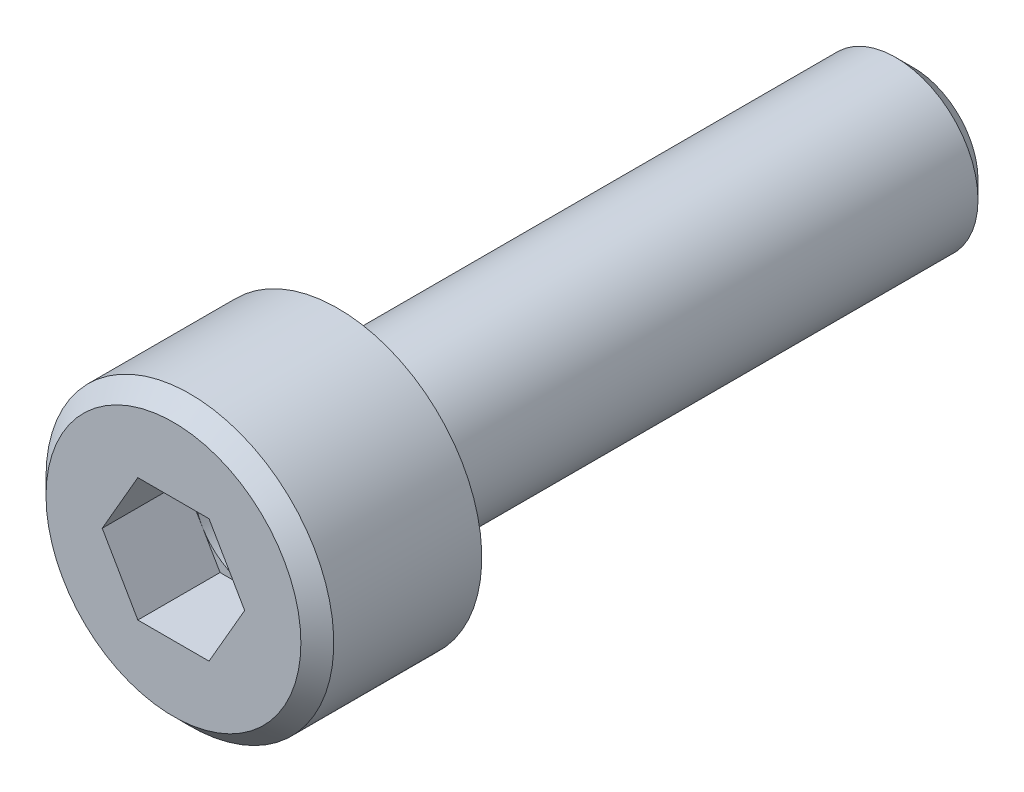
ISO-10303-21;
HEADER;
FILE_DESCRIPTION(('STEP AP214'),'2;1');
FILE_NAME('part.step','',(''),(''),'','','');
FILE_SCHEMA(('AUTOMOTIVE_DESIGN { 1 0 10303 214 1 1 1 1 }'));
ENDSEC;
DATA;
#1=APPLICATION_CONTEXT('core data for automotive mechanical design processes');
#2=APPLICATION_PROTOCOL_DEFINITION('international standard','automotive_design',2000,#1);
#3=PRODUCT_CONTEXT('',#1,'mechanical');
#4=PRODUCT('Part','Part','',(#3));
#5=PRODUCT_RELATED_PRODUCT_CATEGORY('part','',(#4));
#6=PRODUCT_DEFINITION_FORMATION('','',#4);
#7=PRODUCT_DEFINITION_CONTEXT('part definition',#1,'design');
#8=PRODUCT_DEFINITION('design','',#6,#7);
#9=PRODUCT_DEFINITION_SHAPE('','',#8);
#10=(LENGTH_UNIT() NAMED_UNIT(*) SI_UNIT(.MILLI.,.METRE.));
#11=(NAMED_UNIT(*) PLANE_ANGLE_UNIT() SI_UNIT($,.RADIAN.));
#12=(NAMED_UNIT(*) SI_UNIT($,.STERADIAN.) SOLID_ANGLE_UNIT());
#13=UNCERTAINTY_MEASURE_WITH_UNIT(LENGTH_MEASURE(1.E-05),#10,'distance_accuracy_value','');
#14=(GEOMETRIC_REPRESENTATION_CONTEXT(3) GLOBAL_UNCERTAINTY_ASSIGNED_CONTEXT((#13)) GLOBAL_UNIT_ASSIGNED_CONTEXT((#10,
#11,#12)) REPRESENTATION_CONTEXT('',''));
#15=CARTESIAN_POINT('',(0.,0.,0.));
#16=DIRECTION('',(0.,0.,1.));
#17=DIRECTION('',(1.,0.,0.));
#18=AXIS2_PLACEMENT_3D('',#15,#16,#17);
#19=CARTESIAN_POINT('',(-18.7,-8.1,7.40000000001828));
#20=DIRECTION('',(0.,0.,1.));
#21=DIRECTION('',(1.,0.,0.));
#22=AXIS2_PLACEMENT_3D('',#19,#20,#21);
#23=CONICAL_SURFACE('',#22,1.49999999986394,1.04719755116079);
#24=CARTESIAN_POINT('',(-18.7,-8.10000000004152,6.53397459629446));
#25=VERTEX_POINT('',#24);
#26=VERTEX_LOOP('',#25);
#27=FACE_BOUND('',#26,.T.);
#28=CARTESIAN_POINT('',(-18.7,-8.1,7.4));
#29=DIRECTION('',(0.,0.,1.));
#30=DIRECTION('',(1.,0.,0.));
#31=AXIS2_PLACEMENT_3D('',#28,#29,#30);
#32=CIRCLE('',#31,1.5);
#33=CARTESIAN_POINT('',(-17.2,-8.1,7.4));
#34=VERTEX_POINT('',#33);
#35=EDGE_CURVE('E165',#34,#34,#32,.T.);
#36=ORIENTED_EDGE('',*,*,#35,.T.);
#37=EDGE_LOOP('',(#36));
#38=FACE_BOUND('',#37,.T.);
#39=ADVANCED_FACE('F16',(#27,#38),#23,.F.);
#40=CARTESIAN_POINT('',(-18.7,-8.1,10.));
#41=DIRECTION('',(0.,0.,1.));
#42=DIRECTION('',(1.,0.,0.));
#43=AXIS2_PLACEMENT_3D('',#40,#41,#42);
#44=CYLINDRICAL_SURFACE('',#43,1.5);
#45=CARTESIAN_POINT('',(-18.7,-8.1,8.));
#46=DIRECTION('',(0.,0.,1.));
#47=DIRECTION('',(1.,0.,0.));
#48=AXIS2_PLACEMENT_3D('',#45,#46,#47);
#49=CIRCLE('',#48,1.5);
#50=CARTESIAN_POINT('',(-18.7,-9.6,8.));
#51=VERTEX_POINT('',#50);
#52=CARTESIAN_POINT('',(-19.9990381056767,-8.85,8.));
#53=VERTEX_POINT('',#52);
#54=EDGE_CURVE('E122',#51,#53,#49,.F.);
#55=ORIENTED_EDGE('',*,*,#54,.F.);
#56=CARTESIAN_POINT('',(-18.7,-8.1,8.));
#57=DIRECTION('',(0.,0.,1.));
#58=DIRECTION('',(1.,0.,0.));
#59=AXIS2_PLACEMENT_3D('',#56,#57,#58);
#60=CIRCLE('',#59,1.5);
#61=CARTESIAN_POINT('',(-17.4009618943234,-8.85,8.));
#62=VERTEX_POINT('',#61);
#63=EDGE_CURVE('E177',#51,#62,#60,.T.);
#64=ORIENTED_EDGE('',*,*,#63,.T.);
#65=CARTESIAN_POINT('',(-18.7,-8.1,8.));
#66=DIRECTION('',(0.,0.,1.));
#67=DIRECTION('',(1.,0.,0.));
#68=AXIS2_PLACEMENT_3D('',#65,#66,#67);
#69=CIRCLE('',#68,1.5);
#70=CARTESIAN_POINT('',(-17.4009618943234,-7.35000000000001,8.));
#71=VERTEX_POINT('',#70);
#72=EDGE_CURVE('E168',#62,#71,#69,.T.);
#73=ORIENTED_EDGE('',*,*,#72,.T.);
#74=CARTESIAN_POINT('',(-18.7,-8.1,8.));
#75=DIRECTION('',(0.,0.,1.));
#76=DIRECTION('',(1.,0.,0.));
#77=AXIS2_PLACEMENT_3D('',#74,#75,#76);
#78=CIRCLE('',#77,1.5);
#79=CARTESIAN_POINT('',(-18.7,-6.6,8.));
#80=VERTEX_POINT('',#79);
#81=EDGE_CURVE('E172',#71,#80,#78,.T.);
#82=ORIENTED_EDGE('',*,*,#81,.T.);
#83=CARTESIAN_POINT('',(-18.7,-8.1,8.));
#84=DIRECTION('',(0.,0.,1.));
#85=DIRECTION('',(1.,0.,0.));
#86=AXIS2_PLACEMENT_3D('',#83,#84,#85);
#87=CIRCLE('',#86,1.5);
#88=CARTESIAN_POINT('',(-19.9990381056767,-7.35,8.));
#89=VERTEX_POINT('',#88);
#90=EDGE_CURVE('E158',#89,#80,#87,.F.);
#91=ORIENTED_EDGE('',*,*,#90,.F.);
#92=CARTESIAN_POINT('',(-18.7,-8.1,8.));
#93=DIRECTION('',(0.,0.,1.));
#94=DIRECTION('',(1.,0.,0.));
#95=AXIS2_PLACEMENT_3D('',#92,#93,#94);
#96=CIRCLE('',#95,1.5);
#97=EDGE_CURVE('E131',#53,#89,#96,.F.);
#98=ORIENTED_EDGE('',*,*,#97,.F.);
#99=EDGE_LOOP('',(#55,#64,#73,#82,#91,#98));
#100=FACE_BOUND('',#99,.T.);
#101=ORIENTED_EDGE('',*,*,#35,.F.);
#102=EDGE_LOOP('',(#101));
#103=FACE_BOUND('',#102,.T.);
#104=ADVANCED_FACE('F155',(#100,#103),#44,.F.);
#105=CARTESIAN_POINT('',(-18.7,-8.1,8.));
#106=DIRECTION('',(0.,0.,-1.));
#107=DIRECTION('',(-1.,0.,0.));
#108=AXIS2_PLACEMENT_3D('',#105,#106,#107);
#109=PLANE('',#108);
#110=DIRECTION('',(0.5,-0.866025403784439,0.));
#111=VECTOR('',#110,1.);
#112=CARTESIAN_POINT('',(-17.4009618943234,-7.35,8.));
#113=LINE('',#112,#111);
#114=CARTESIAN_POINT('',(-16.9679491924312,-8.09999999999999,8.));
#115=VERTEX_POINT('',#114);
#116=EDGE_CURVE('E171',#71,#115,#113,.T.);
#117=ORIENTED_EDGE('',*,*,#116,.F.);
#118=ORIENTED_EDGE('',*,*,#72,.F.);
#119=DIRECTION('',(-0.5,-0.866025403784439,0.));
#120=VECTOR('',#119,1.);
#121=CARTESIAN_POINT('',(-17.4009618943234,-8.85,8.));
#122=LINE('',#121,#120);
#123=EDGE_CURVE('E180',#115,#62,#122,.T.);
#124=ORIENTED_EDGE('',*,*,#123,.F.);
#125=EDGE_LOOP('',(#117,#118,#124));
#126=FACE_BOUND('',#125,.T.);
#127=ADVANCED_FACE('F412',(#126),#109,.F.);
#128=CARTESIAN_POINT('',(-17.4009618943234,-7.35,9.5));
#129=DIRECTION('',(-0.866025403784439,-0.5,0.));
#130=DIRECTION('',(0.5,-0.866025403784439,0.));
#131=AXIS2_PLACEMENT_3D('',#128,#129,#130);
#132=PLANE('',#131);
#133=DIRECTION('',(0.5,-0.866025403784439,0.));
#134=VECTOR('',#133,1.);
#135=CARTESIAN_POINT('',(-17.4009618943234,-7.35,10.));
#136=LINE('',#135,#134);
#137=CARTESIAN_POINT('',(-16.9679491924312,-8.1,10.));
#138=VERTEX_POINT('',#137);
#139=CARTESIAN_POINT('',(-17.8339745962156,-6.6,10.));
#140=VERTEX_POINT('',#139);
#141=EDGE_CURVE('E176',#138,#140,#136,.F.);
#142=ORIENTED_EDGE('',*,*,#141,.T.);
#143=DIRECTION('',(0.,0.,1.));
#144=VECTOR('',#143,1.);
#145=CARTESIAN_POINT('',(-17.8339745962156,-6.6,10.));
#146=LINE('',#145,#144);
#147=CARTESIAN_POINT('',(-17.8339745962156,-6.6,8.));
#148=VERTEX_POINT('',#147);
#149=EDGE_CURVE('E227',#140,#148,#146,.F.);
#150=ORIENTED_EDGE('',*,*,#149,.T.);
#151=DIRECTION('',(0.499999999999981,-0.86602540378445,0.));
#152=VECTOR('',#151,1.);
#153=CARTESIAN_POINT('',(-17.8339745962156,-6.6,8.));
#154=LINE('',#153,#152);
#155=EDGE_CURVE('E175',#148,#71,#154,.T.);
#156=ORIENTED_EDGE('',*,*,#155,.T.);
#157=ORIENTED_EDGE('',*,*,#116,.T.);
#158=DIRECTION('',(0.,0.,1.));
#159=VECTOR('',#158,1.);
#160=CARTESIAN_POINT('',(-16.9679491924312,-8.09999999999996,9.5));
#161=LINE('',#160,#159);
#162=EDGE_CURVE('E203',#138,#115,#161,.F.);
#163=ORIENTED_EDGE('',*,*,#162,.F.);
#164=EDGE_LOOP('',(#142,#150,#156,#157,#163));
#165=FACE_BOUND('',#164,.T.);
#166=ADVANCED_FACE('F408',(#165),#132,.T.);
#167=CARTESIAN_POINT('',(-18.7,-8.1,8.));
#168=DIRECTION('',(0.,0.,-1.));
#169=DIRECTION('',(-1.,0.,0.));
#170=AXIS2_PLACEMENT_3D('',#167,#168,#169);
#171=PLANE('',#170);
#172=DIRECTION('',(1.,0.,0.));
#173=VECTOR('',#172,1.);
#174=CARTESIAN_POINT('',(-18.7,-6.6,8.));
#175=LINE('',#174,#173);
#176=EDGE_CURVE('E230',#148,#80,#175,.F.);
#177=ORIENTED_EDGE('',*,*,#176,.T.);
#178=ORIENTED_EDGE('',*,*,#81,.F.);
#179=ORIENTED_EDGE('',*,*,#155,.F.);
#180=EDGE_LOOP('',(#177,#178,#179));
#181=FACE_BOUND('',#180,.T.);
#182=ADVANCED_FACE('F404',(#181),#171,.F.);
#183=CARTESIAN_POINT('',(-18.7,-8.1,8.));
#184=DIRECTION('',(0.,0.,-1.));
#185=DIRECTION('',(-1.,0.,0.));
#186=AXIS2_PLACEMENT_3D('',#183,#184,#185);
#187=PLANE('',#186);
#188=DIRECTION('',(-0.5,-0.866025403784439,0.));
#189=VECTOR('',#188,1.);
#190=CARTESIAN_POINT('',(-17.4009618943234,-8.85,8.));
#191=LINE('',#190,#189);
#192=CARTESIAN_POINT('',(-17.8339745962156,-9.6,8.));
#193=VERTEX_POINT('',#192);
#194=EDGE_CURVE('E204',#62,#193,#191,.T.);
#195=ORIENTED_EDGE('',*,*,#194,.F.);
#196=ORIENTED_EDGE('',*,*,#63,.F.);
#197=DIRECTION('',(1.,0.,0.));
#198=VECTOR('',#197,1.);
#199=CARTESIAN_POINT('',(-18.7,-9.6,8.));
#200=LINE('',#199,#198);
#201=EDGE_CURVE('E116',#193,#51,#200,.F.);
#202=ORIENTED_EDGE('',*,*,#201,.F.);
#203=EDGE_LOOP('',(#195,#196,#202));
#204=FACE_BOUND('',#203,.T.);
#205=ADVANCED_FACE('F400',(#204),#187,.F.);
#206=CARTESIAN_POINT('',(-17.4009618943234,-8.85,9.5));
#207=DIRECTION('',(-0.866025403784439,0.5,0.));
#208=DIRECTION('',(-0.5,-0.866025403784439,0.));
#209=AXIS2_PLACEMENT_3D('',#206,#207,#208);
#210=PLANE('',#209);
#211=DIRECTION('',(-0.5,-0.866025403784439,0.));
#212=VECTOR('',#211,1.);
#213=CARTESIAN_POINT('',(-17.4009618943234,-8.85,10.));
#214=LINE('',#213,#212);
#215=CARTESIAN_POINT('',(-17.8339745962156,-9.6,10.));
#216=VERTEX_POINT('',#215);
#217=EDGE_CURVE('E199',#216,#138,#214,.F.);
#218=ORIENTED_EDGE('',*,*,#217,.T.);
#219=ORIENTED_EDGE('',*,*,#162,.T.);
#220=ORIENTED_EDGE('',*,*,#123,.T.);
#221=ORIENTED_EDGE('',*,*,#194,.T.);
#222=DIRECTION('',(0.,0.,1.));
#223=VECTOR('',#222,1.);
#224=CARTESIAN_POINT('',(-17.8339745962156,-9.6,10.));
#225=LINE('',#224,#223);
#226=EDGE_CURVE('E244',#216,#193,#225,.F.);
#227=ORIENTED_EDGE('',*,*,#226,.F.);
#228=EDGE_LOOP('',(#218,#219,#220,#221,#227));
#229=FACE_BOUND('',#228,.T.);
#230=ADVANCED_FACE('F396',(#229),#210,.T.);
#231=CARTESIAN_POINT('',(-18.7,-6.6,10.));
#232=DIRECTION('',(0.,1.,0.));
#233=DIRECTION('',(0.,0.,1.));
#234=AXIS2_PLACEMENT_3D('',#231,#232,#233);
#235=PLANE('',#234);
#236=ORIENTED_EDGE('',*,*,#149,.F.);
#237=DIRECTION('',(1.,0.,0.));
#238=VECTOR('',#237,1.);
#239=CARTESIAN_POINT('',(-18.7,-6.6,10.));
#240=LINE('',#239,#238);
#241=CARTESIAN_POINT('',(-19.5660254037845,-6.6,10.));
#242=VERTEX_POINT('',#241);
#243=EDGE_CURVE('E209',#242,#140,#240,.T.);
#244=ORIENTED_EDGE('',*,*,#243,.F.);
#245=DIRECTION('',(0.,0.,1.));
#246=VECTOR('',#245,1.);
#247=CARTESIAN_POINT('',(-19.5660254037845,-6.60000000000001,9.5));
#248=LINE('',#247,#246);
#249=CARTESIAN_POINT('',(-19.5660254037845,-6.6,8.));
#250=VERTEX_POINT('',#249);
#251=EDGE_CURVE('E264',#242,#250,#248,.F.);
#252=ORIENTED_EDGE('',*,*,#251,.T.);
#253=DIRECTION('',(-1.,0.,0.));
#254=VECTOR('',#253,1.);
#255=CARTESIAN_POINT('',(-18.7,-6.6,8.));
#256=LINE('',#255,#254);
#257=EDGE_CURVE('E241',#250,#80,#256,.F.);
#258=ORIENTED_EDGE('',*,*,#257,.T.);
#259=ORIENTED_EDGE('',*,*,#176,.F.);
#260=EDGE_LOOP('',(#236,#244,#252,#258,#259));
#261=FACE_BOUND('',#260,.T.);
#262=ADVANCED_FACE('F392',(#261),#235,.F.);
#263=CARTESIAN_POINT('',(-18.7,-8.1,8.));
#264=DIRECTION('',(0.,0.,-1.));
#265=DIRECTION('',(-1.,0.,0.));
#266=AXIS2_PLACEMENT_3D('',#263,#264,#265);
#267=PLANE('',#266);
#268=DIRECTION('',(-0.5,-0.866025403784439,0.));
#269=VECTOR('',#268,1.);
#270=CARTESIAN_POINT('',(-19.9990381056767,-7.35,8.));
#271=LINE('',#270,#269);
#272=EDGE_CURVE('E267',#250,#89,#271,.T.);
#273=ORIENTED_EDGE('',*,*,#272,.T.);
#274=ORIENTED_EDGE('',*,*,#90,.T.);
#275=ORIENTED_EDGE('',*,*,#257,.F.);
#276=EDGE_LOOP('',(#273,#274,#275));
#277=FACE_BOUND('',#276,.T.);
#278=ADVANCED_FACE('F389',(#277),#267,.F.);
#279=CARTESIAN_POINT('',(-18.7,-8.1,8.));
#280=DIRECTION('',(0.,0.,-1.));
#281=DIRECTION('',(-1.,0.,0.));
#282=AXIS2_PLACEMENT_3D('',#279,#280,#281);
#283=PLANE('',#282);
#284=DIRECTION('',(1.,0.,0.));
#285=VECTOR('',#284,1.);
#286=CARTESIAN_POINT('',(-18.7,-9.6,8.));
#287=LINE('',#286,#285);
#288=CARTESIAN_POINT('',(-19.5660254037845,-9.6,8.));
#289=VERTEX_POINT('',#288);
#290=EDGE_CURVE('E126',#51,#289,#287,.F.);
#291=ORIENTED_EDGE('',*,*,#290,.F.);
#292=ORIENTED_EDGE('',*,*,#54,.T.);
#293=DIRECTION('',(0.5,-0.866025403784439,0.));
#294=VECTOR('',#293,1.);
#295=CARTESIAN_POINT('',(-19.9990381056767,-8.85,8.));
#296=LINE('',#295,#294);
#297=EDGE_CURVE('E125',#53,#289,#296,.T.);
#298=ORIENTED_EDGE('',*,*,#297,.T.);
#299=EDGE_LOOP('',(#291,#292,#298));
#300=FACE_BOUND('',#299,.T.);
#301=ADVANCED_FACE('F124',(#300),#283,.F.);
#302=CARTESIAN_POINT('',(-18.7,-9.6,10.));
#303=DIRECTION('',(0.,1.,0.));
#304=DIRECTION('',(0.,0.,1.));
#305=AXIS2_PLACEMENT_3D('',#302,#303,#304);
#306=PLANE('',#305);
#307=DIRECTION('',(1.,0.,0.));
#308=VECTOR('',#307,1.);
#309=CARTESIAN_POINT('',(-18.7,-9.6,10.));
#310=LINE('',#309,#308);
#311=CARTESIAN_POINT('',(-19.5660254037845,-9.6,10.));
#312=VERTEX_POINT('',#311);
#313=EDGE_CURVE('E248',#312,#216,#310,.T.);
#314=ORIENTED_EDGE('',*,*,#313,.T.);
#315=ORIENTED_EDGE('',*,*,#226,.T.);
#316=ORIENTED_EDGE('',*,*,#201,.T.);
#317=ORIENTED_EDGE('',*,*,#290,.T.);
#318=DIRECTION('',(0.,0.,1.));
#319=VECTOR('',#318,1.);
#320=CARTESIAN_POINT('',(-19.5660254037845,-9.59999999999999,9.5));
#321=LINE('',#320,#319);
#322=EDGE_CURVE('E142',#289,#312,#321,.T.);
#323=ORIENTED_EDGE('',*,*,#322,.T.);
#324=EDGE_LOOP('',(#314,#315,#316,#317,#323));
#325=FACE_BOUND('',#324,.T.);
#326=ADVANCED_FACE('F383',(#325),#306,.T.);
#327=CARTESIAN_POINT('',(-19.9990381056767,-7.35,9.5));
#328=DIRECTION('',(-0.866025403784439,0.5,0.));
#329=DIRECTION('',(-0.5,-0.866025403784439,0.));
#330=AXIS2_PLACEMENT_3D('',#327,#328,#329);
#331=PLANE('',#330);
#332=ORIENTED_EDGE('',*,*,#251,.F.);
#333=DIRECTION('',(-0.5,-0.866025403784439,0.));
#334=VECTOR('',#333,1.);
#335=CARTESIAN_POINT('',(-19.9990381056767,-7.35,10.));
#336=LINE('',#335,#334);
#337=CARTESIAN_POINT('',(-20.4320508075689,-8.1,10.));
#338=VERTEX_POINT('',#337);
#339=EDGE_CURVE('E247',#338,#242,#336,.F.);
#340=ORIENTED_EDGE('',*,*,#339,.F.);
#341=DIRECTION('',(0.,0.,1.));
#342=VECTOR('',#341,1.);
#343=CARTESIAN_POINT('',(-20.4320508075689,-8.10000000000001,9.5));
#344=LINE('',#343,#342);
#345=CARTESIAN_POINT('',(-20.4320508075689,-8.1,8.));
#346=VERTEX_POINT('',#345);
#347=EDGE_CURVE('E152',#338,#346,#344,.F.);
#348=ORIENTED_EDGE('',*,*,#347,.T.);
#349=DIRECTION('',(0.499999999999984,0.866025403784448,0.));
#350=VECTOR('',#349,1.);
#351=CARTESIAN_POINT('',(-20.4320508075689,-8.1,8.));
#352=LINE('',#351,#350);
#353=EDGE_CURVE('E144',#346,#89,#352,.T.);
#354=ORIENTED_EDGE('',*,*,#353,.T.);
#355=ORIENTED_EDGE('',*,*,#272,.F.);
#356=EDGE_LOOP('',(#332,#340,#348,#354,#355));
#357=FACE_BOUND('',#356,.T.);
#358=ADVANCED_FACE('F380',(#357),#331,.F.);
#359=CARTESIAN_POINT('',(-18.7,-8.1,8.));
#360=DIRECTION('',(0.,0.,-1.));
#361=DIRECTION('',(-1.,0.,0.));
#362=AXIS2_PLACEMENT_3D('',#359,#360,#361);
#363=PLANE('',#362);
#364=DIRECTION('',(0.5,-0.866025403784439,0.));
#365=VECTOR('',#364,1.);
#366=CARTESIAN_POINT('',(-19.9990381056767,-8.85,8.));
#367=LINE('',#366,#365);
#368=EDGE_CURVE('E139',#346,#53,#367,.T.);
#369=ORIENTED_EDGE('',*,*,#368,.T.);
#370=ORIENTED_EDGE('',*,*,#97,.T.);
#371=ORIENTED_EDGE('',*,*,#353,.F.);
#372=EDGE_LOOP('',(#369,#370,#371));
#373=FACE_BOUND('',#372,.T.);
#374=ADVANCED_FACE('F148',(#373),#363,.F.);
#375=CARTESIAN_POINT('',(-19.9990381056767,-8.85,9.5));
#376=DIRECTION('',(-0.866025403784439,-0.5,0.));
#377=DIRECTION('',(0.5,-0.866025403784439,0.));
#378=AXIS2_PLACEMENT_3D('',#375,#376,#377);
#379=PLANE('',#378);
#380=ORIENTED_EDGE('',*,*,#347,.F.);
#381=DIRECTION('',(-0.499999999999984,0.866025403784448,0.));
#382=VECTOR('',#381,1.);
#383=CARTESIAN_POINT('',(-19.5660254037845,-9.6,10.));
#384=LINE('',#383,#382);
#385=EDGE_CURVE('E151',#312,#338,#384,.T.);
#386=ORIENTED_EDGE('',*,*,#385,.F.);
#387=ORIENTED_EDGE('',*,*,#322,.F.);
#388=ORIENTED_EDGE('',*,*,#297,.F.);
#389=ORIENTED_EDGE('',*,*,#368,.F.);
#390=EDGE_LOOP('',(#380,#386,#387,#388,#389));
#391=FACE_BOUND('',#390,.T.);
#392=ADVANCED_FACE('F138',(#391),#379,.F.);
#393=CARTESIAN_POINT('',(-18.7,-8.1,10.));
#394=DIRECTION('',(0.,0.,1.));
#395=DIRECTION('',(1.,0.,0.));
#396=AXIS2_PLACEMENT_3D('',#393,#394,#395);
#397=PLANE('',#396);
#398=ORIENTED_EDGE('',*,*,#313,.F.);
#399=ORIENTED_EDGE('',*,*,#385,.T.);
#400=ORIENTED_EDGE('',*,*,#339,.T.);
#401=ORIENTED_EDGE('',*,*,#243,.T.);
#402=ORIENTED_EDGE('',*,*,#141,.F.);
#403=ORIENTED_EDGE('',*,*,#217,.F.);
#404=EDGE_LOOP('',(#398,#399,#400,#401,#402,#403));
#405=FACE_BOUND('',#404,.T.);
#406=CARTESIAN_POINT('',(-18.7,-8.1,10.0000000000477));
#407=DIRECTION('',(0.,0.,-1.));
#408=DIRECTION('',(-1.,0.,0.));
#409=AXIS2_PLACEMENT_3D('',#406,#407,#408);
#410=CIRCLE('',#409,3.0999999999477);
#411=CARTESIAN_POINT('',(-21.7999999999477,-8.1,10.0000000000477));
#412=VERTEX_POINT('',#411);
#413=EDGE_CURVE('E181',#412,#412,#410,.T.);
#414=ORIENTED_EDGE('',*,*,#413,.F.);
#415=EDGE_LOOP('',(#414));
#416=FACE_BOUND('',#415,.T.);
#417=ADVANCED_FACE('F371',(#405,#416),#397,.T.);
#418=CARTESIAN_POINT('',(-18.7,-8.1,9.60000000003447));
#419=DIRECTION('',(0.,0.,-1.));
#420=DIRECTION('',(-1.,0.,0.));
#421=AXIS2_PLACEMENT_3D('',#418,#419,#420);
#422=CONICAL_SURFACE('',#421,3.49999999996098,0.785398163397448);
#423=CARTESIAN_POINT('',(-18.7,-8.1,9.6));
#424=DIRECTION('',(0.,0.,-1.));
#425=DIRECTION('',(-1.,0.,0.));
#426=AXIS2_PLACEMENT_3D('',#423,#424,#425);
#427=CIRCLE('',#426,3.5);
#428=CARTESIAN_POINT('',(-22.2,-8.1,9.6));
#429=VERTEX_POINT('',#428);
#430=EDGE_CURVE('E185',#429,#429,#427,.T.);
#431=ORIENTED_EDGE('',*,*,#430,.F.);
#432=EDGE_LOOP('',(#431));
#433=FACE_BOUND('',#432,.T.);
#434=ORIENTED_EDGE('',*,*,#413,.T.);
#435=EDGE_LOOP('',(#434));
#436=FACE_BOUND('',#435,.T.);
#437=ADVANCED_FACE('F367',(#433,#436),#422,.T.);
#438=CARTESIAN_POINT('',(-18.7,-8.1,6.));
#439=DIRECTION('',(0.,0.,-1.));
#440=DIRECTION('',(-1.,0.,0.));
#441=AXIS2_PLACEMENT_3D('',#438,#439,#440);
#442=CYLINDRICAL_SURFACE('',#441,3.5);
#443=ORIENTED_EDGE('',*,*,#430,.T.);
#444=EDGE_LOOP('',(#443));
#445=FACE_BOUND('',#444,.T.);
#446=CARTESIAN_POINT('',(-18.7,-8.1,6.));
#447=DIRECTION('',(0.,0.,-1.));
#448=DIRECTION('',(-1.,0.,0.));
#449=AXIS2_PLACEMENT_3D('',#446,#447,#448);
#450=CIRCLE('',#449,3.5);
#451=CARTESIAN_POINT('',(-22.2,-8.1,6.));
#452=VERTEX_POINT('',#451);
#453=EDGE_CURVE('E186',#452,#452,#450,.T.);
#454=ORIENTED_EDGE('',*,*,#453,.F.);
#455=EDGE_LOOP('',(#454));
#456=FACE_BOUND('',#455,.T.);
#457=ADVANCED_FACE('F363',(#445,#456),#442,.T.);
#458=CARTESIAN_POINT('',(-18.7,-8.1,-8.));
#459=DIRECTION('',(0.,0.,-1.));
#460=DIRECTION('',(-1.,0.,0.));
#461=AXIS2_PLACEMENT_3D('',#458,#459,#460);
#462=PLANE('',#461);
#463=CARTESIAN_POINT('',(-18.7,-8.1,-7.99999999998136));
#464=DIRECTION('',(0.,0.,1.));
#465=DIRECTION('',(1.,0.,0.));
#466=AXIS2_PLACEMENT_3D('',#463,#464,#465);
#467=CIRCLE('',#466,1.57058499998075);
#468=CARTESIAN_POINT('',(-17.1294150000193,-8.1,-7.99999999998136));
#469=VERTEX_POINT('',#468);
#470=EDGE_CURVE('E190',#469,#469,#467,.T.);
#471=ORIENTED_EDGE('',*,*,#470,.F.);
#472=EDGE_LOOP('',(#471));
#473=FACE_BOUND('',#472,.T.);
#474=ADVANCED_FACE('F351',(#473),#462,.T.);
#475=CARTESIAN_POINT('',(-18.7,-8.1,6.));
#476=DIRECTION('',(0.,0.,-1.));
#477=DIRECTION('',(-1.,0.,0.));
#478=AXIS2_PLACEMENT_3D('',#475,#476,#477);
#479=PLANE('',#478);
#480=ORIENTED_EDGE('',*,*,#453,.T.);
#481=EDGE_LOOP('',(#480));
#482=FACE_BOUND('',#481,.T.);
#483=CARTESIAN_POINT('',(-18.7,-8.1,6.));
#484=DIRECTION('',(0.,0.,-1.));
#485=DIRECTION('',(0.,-1.,0.));
#486=AXIS2_PLACEMENT_3D('',#483,#484,#485);
#487=CIRCLE('',#486,2.2);
#488=CARTESIAN_POINT('',(-18.7,-5.9,6.));
#489=VERTEX_POINT('',#488);
#490=CARTESIAN_POINT('',(-18.7,-10.3,6.));
#491=VERTEX_POINT('',#490);
#492=EDGE_CURVE('E194',#489,#491,#487,.F.);
#493=ORIENTED_EDGE('',*,*,#492,.T.);
#494=CARTESIAN_POINT('',(-18.7,-8.1,6.));
#495=DIRECTION('',(0.,0.,-1.));
#496=DIRECTION('',(0.,1.,0.));
#497=AXIS2_PLACEMENT_3D('',#494,#495,#496);
#498=CIRCLE('',#497,2.2);
#499=EDGE_CURVE('E39',#491,#489,#498,.F.);
#500=ORIENTED_EDGE('',*,*,#499,.T.);
#501=EDGE_LOOP('',(#493,#500));
#502=FACE_BOUND('',#501,.T.);
#503=ADVANCED_FACE('F342',(#482,#502),#479,.T.);
#504=CARTESIAN_POINT('',(-18.7,-8.1,-7.57058500005314));
#505=DIRECTION('',(0.,0.,1.));
#506=DIRECTION('',(1.,0.,0.));
#507=AXIS2_PLACEMENT_3D('',#504,#505,#506);
#508=CONICAL_SURFACE('',#507,1.99999999990896,0.785398163397448);
#509=CARTESIAN_POINT('',(-18.7,-8.1,-7.570585));
#510=DIRECTION('',(0.,0.,1.));
#511=DIRECTION('',(1.,0.,0.));
#512=AXIS2_PLACEMENT_3D('',#509,#510,#511);
#513=CIRCLE('',#512,2.);
#514=CARTESIAN_POINT('',(-16.7,-8.1,-7.570585));
#515=VERTEX_POINT('',#514);
#516=EDGE_CURVE('E28',#515,#515,#513,.T.);
#517=ORIENTED_EDGE('',*,*,#516,.F.);
#518=EDGE_LOOP('',(#517));
#519=FACE_BOUND('',#518,.T.);
#520=ORIENTED_EDGE('',*,*,#470,.T.);
#521=EDGE_LOOP('',(#520));
#522=FACE_BOUND('',#521,.T.);
#523=ADVANCED_FACE('F332',(#519,#522),#508,.T.);
#524=CARTESIAN_POINT('',(-18.7,-8.1,5.8));
#525=DIRECTION('',(0.,0.,-1.));
#526=DIRECTION('',(0.,1.,0.));
#527=AXIS2_PLACEMENT_3D('',#524,#525,#526);
#528=TOROIDAL_SURFACE('',#527,2.2,0.2);
#529=ORIENTED_EDGE('',*,*,#499,.F.);
#530=ORIENTED_EDGE('',*,*,#492,.F.);
#531=EDGE_LOOP('',(#529,#530));
#532=FACE_BOUND('',#531,.T.);
#533=CARTESIAN_POINT('',(-18.7,-8.1,5.8));
#534=DIRECTION('',(0.,0.,1.));
#535=DIRECTION('',(1.,0.,0.));
#536=AXIS2_PLACEMENT_3D('',#533,#534,#535);
#537=CIRCLE('',#536,2.);
#538=CARTESIAN_POINT('',(-16.7,-8.1,5.8));
#539=VERTEX_POINT('',#538);
#540=EDGE_CURVE('E11',#539,#539,#537,.F.);
#541=ORIENTED_EDGE('',*,*,#540,.F.);
#542=EDGE_LOOP('',(#541));
#543=FACE_BOUND('',#542,.T.);
#544=ADVANCED_FACE('F320',(#532,#543),#528,.F.);
#545=CARTESIAN_POINT('',(-18.7,-8.1,6.));
#546=DIRECTION('',(0.,0.,1.));
#547=DIRECTION('',(1.,0.,0.));
#548=AXIS2_PLACEMENT_3D('',#545,#546,#547);
#549=CYLINDRICAL_SURFACE('',#548,2.);
#550=ORIENTED_EDGE('',*,*,#516,.T.);
#551=EDGE_LOOP('',(#550));
#552=FACE_BOUND('',#551,.T.);
#553=ORIENTED_EDGE('',*,*,#540,.T.);
#554=EDGE_LOOP('',(#553));
#555=FACE_BOUND('',#554,.T.);
#556=ADVANCED_FACE('F331',(#552,#555),#549,.T.);
#557=CLOSED_SHELL('',(#39,#104,#127,#166,#182,#205,#230,#262,#278,#301,#326,#358,#374,#392,#417,
#437,#457,#474,#503,#523,#544,#556));
#558=MANIFOLD_SOLID_BREP('B1',#557);
#559=ADVANCED_BREP_SHAPE_REPRESENTATION('',(#18,#558),#14);
#560=SHAPE_DEFINITION_REPRESENTATION(#9,#559);
ENDSEC;
END-ISO-10303-21;
